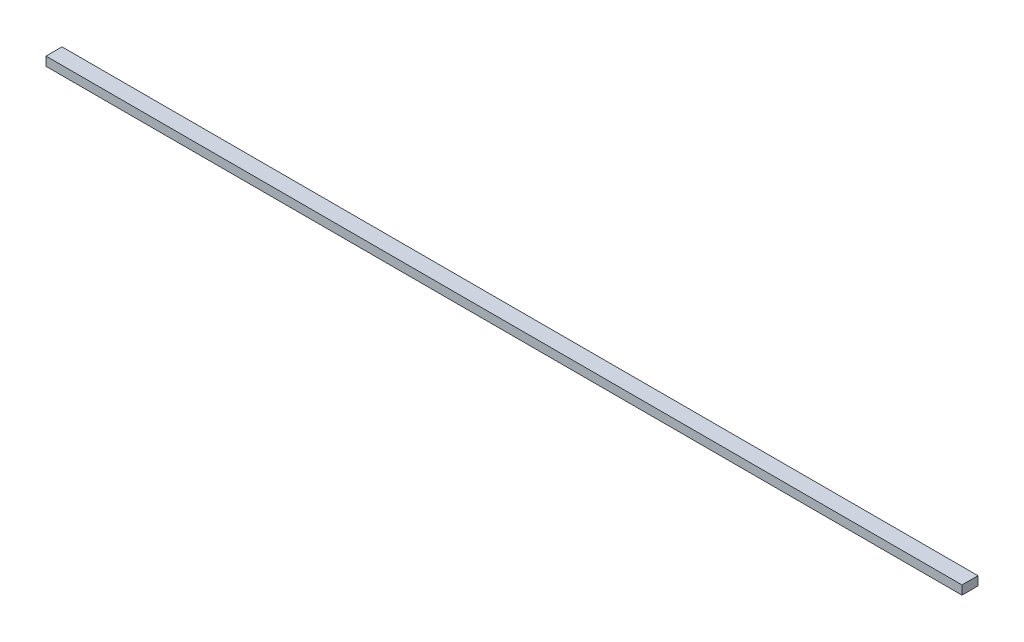
ISO-10303-21;
HEADER;
FILE_DESCRIPTION(('STEP AP214'),'2;1');
FILE_NAME('part.step','',(''),(''),'','','');
FILE_SCHEMA(('AUTOMOTIVE_DESIGN { 1 0 10303 214 1 1 1 1 }'));
ENDSEC;
DATA;
#1=APPLICATION_CONTEXT('core data for automotive mechanical design processes');
#2=APPLICATION_PROTOCOL_DEFINITION('international standard','automotive_design',2000,#1);
#3=PRODUCT_CONTEXT('',#1,'mechanical');
#4=PRODUCT('Part','Part','',(#3));
#5=PRODUCT_RELATED_PRODUCT_CATEGORY('part','',(#4));
#6=PRODUCT_DEFINITION_FORMATION('','',#4);
#7=PRODUCT_DEFINITION_CONTEXT('part definition',#1,'design');
#8=PRODUCT_DEFINITION('design','',#6,#7);
#9=PRODUCT_DEFINITION_SHAPE('','',#8);
#10=(LENGTH_UNIT() NAMED_UNIT(*) SI_UNIT(.MILLI.,.METRE.));
#11=(NAMED_UNIT(*) PLANE_ANGLE_UNIT() SI_UNIT($,.RADIAN.));
#12=(NAMED_UNIT(*) SI_UNIT($,.STERADIAN.) SOLID_ANGLE_UNIT());
#13=UNCERTAINTY_MEASURE_WITH_UNIT(LENGTH_MEASURE(1.E-05),#10,'distance_accuracy_value','');
#14=(GEOMETRIC_REPRESENTATION_CONTEXT(3) GLOBAL_UNCERTAINTY_ASSIGNED_CONTEXT((#13)) GLOBAL_UNIT_ASSIGNED_CONTEXT((#10,
#11,#12)) REPRESENTATION_CONTEXT('',''));
#15=CARTESIAN_POINT('',(0.,0.,0.));
#16=DIRECTION('',(0.,0.,1.));
#17=DIRECTION('',(1.,0.,0.));
#18=AXIS2_PLACEMENT_3D('',#15,#16,#17);
#19=CARTESIAN_POINT('',(257.5,5.,4.5));
#20=DIRECTION('',(-1.,0.,0.));
#21=DIRECTION('',(0.,0.,1.));
#22=AXIS2_PLACEMENT_3D('',#19,#20,#21);
#23=PLANE('',#22);
#24=DIRECTION('',(0.,0.,-1.));
#25=VECTOR('',#24,1.);
#26=CARTESIAN_POINT('',(257.5,0.,4.5));
#27=LINE('',#26,#25);
#28=CARTESIAN_POINT('',(257.5,0.,4.5));
#29=VERTEX_POINT('',#28);
#30=CARTESIAN_POINT('',(257.5,0.,-4.5));
#31=VERTEX_POINT('',#30);
#32=EDGE_CURVE('E107',#29,#31,#27,.T.);
#33=ORIENTED_EDGE('',*,*,#32,.T.);
#34=DIRECTION('',(0.,-1.,0.));
#35=VECTOR('',#34,1.);
#36=CARTESIAN_POINT('',(257.5,5.,-4.5));
#37=LINE('',#36,#35);
#38=CARTESIAN_POINT('',(257.5,5.,-4.5));
#39=VERTEX_POINT('',#38);
#40=EDGE_CURVE('E11',#39,#31,#37,.T.);
#41=ORIENTED_EDGE('',*,*,#40,.F.);
#42=DIRECTION('',(0.,0.,-1.));
#43=VECTOR('',#42,1.);
#44=CARTESIAN_POINT('',(257.5,5.,4.5));
#45=LINE('',#44,#43);
#46=CARTESIAN_POINT('',(257.5,5.,4.5));
#47=VERTEX_POINT('',#46);
#48=EDGE_CURVE('E91',#47,#39,#45,.T.);
#49=ORIENTED_EDGE('',*,*,#48,.F.);
#50=DIRECTION('',(0.,-1.,0.));
#51=VECTOR('',#50,1.);
#52=CARTESIAN_POINT('',(257.5,5.,4.5));
#53=LINE('',#52,#51);
#54=EDGE_CURVE('E103',#47,#29,#53,.T.);
#55=ORIENTED_EDGE('',*,*,#54,.T.);
#56=EDGE_LOOP('',(#33,#41,#49,#55));
#57=FACE_BOUND('',#56,.T.);
#58=ADVANCED_FACE('F39',(#57),#23,.F.);
#59=CARTESIAN_POINT('',(-257.5,5.,-4.5));
#60=DIRECTION('',(0.,0.,1.));
#61=DIRECTION('',(1.,0.,0.));
#62=AXIS2_PLACEMENT_3D('',#59,#60,#61);
#63=PLANE('',#62);
#64=DIRECTION('',(-1.,0.,0.));
#65=VECTOR('',#64,1.);
#66=CARTESIAN_POINT('',(-257.5,0.,-4.5));
#67=LINE('',#66,#65);
#68=CARTESIAN_POINT('',(-257.5,0.,-4.5));
#69=VERTEX_POINT('',#68);
#70=EDGE_CURVE('E96',#31,#69,#67,.T.);
#71=ORIENTED_EDGE('',*,*,#70,.T.);
#72=DIRECTION('',(0.,-1.,0.));
#73=VECTOR('',#72,1.);
#74=CARTESIAN_POINT('',(-257.5,5.,-4.5));
#75=LINE('',#74,#73);
#76=CARTESIAN_POINT('',(-257.5,5.,-4.5));
#77=VERTEX_POINT('',#76);
#78=EDGE_CURVE('E48',#77,#69,#75,.T.);
#79=ORIENTED_EDGE('',*,*,#78,.F.);
#80=DIRECTION('',(-1.,0.,0.));
#81=VECTOR('',#80,1.);
#82=CARTESIAN_POINT('',(-257.5,5.,-4.5));
#83=LINE('',#82,#81);
#84=EDGE_CURVE('E86',#39,#77,#83,.T.);
#85=ORIENTED_EDGE('',*,*,#84,.F.);
#86=ORIENTED_EDGE('',*,*,#40,.T.);
#87=EDGE_LOOP('',(#71,#79,#85,#86));
#88=FACE_BOUND('',#87,.T.);
#89=ADVANCED_FACE('F95',(#88),#63,.F.);
#90=CARTESIAN_POINT('',(-257.5,5.,4.5));
#91=DIRECTION('',(1.,0.,0.));
#92=DIRECTION('',(0.,0.,-1.));
#93=AXIS2_PLACEMENT_3D('',#90,#91,#92);
#94=PLANE('',#93);
#95=DIRECTION('',(0.,0.,1.));
#96=VECTOR('',#95,1.);
#97=CARTESIAN_POINT('',(-257.5,0.,4.5));
#98=LINE('',#97,#96);
#99=CARTESIAN_POINT('',(-257.5,0.,4.5));
#100=VERTEX_POINT('',#99);
#101=EDGE_CURVE('E73',#69,#100,#98,.T.);
#102=ORIENTED_EDGE('',*,*,#101,.T.);
#103=DIRECTION('',(0.,-1.,0.));
#104=VECTOR('',#103,1.);
#105=CARTESIAN_POINT('',(-257.5,5.,4.5));
#106=LINE('',#105,#104);
#107=CARTESIAN_POINT('',(-257.5,5.,4.5));
#108=VERTEX_POINT('',#107);
#109=EDGE_CURVE('E98',#108,#100,#106,.T.);
#110=ORIENTED_EDGE('',*,*,#109,.F.);
#111=DIRECTION('',(0.,0.,1.));
#112=VECTOR('',#111,1.);
#113=CARTESIAN_POINT('',(-257.5,5.,4.5));
#114=LINE('',#113,#112);
#115=EDGE_CURVE('E89',#77,#108,#114,.T.);
#116=ORIENTED_EDGE('',*,*,#115,.F.);
#117=ORIENTED_EDGE('',*,*,#78,.T.);
#118=EDGE_LOOP('',(#102,#110,#116,#117));
#119=FACE_BOUND('',#118,.T.);
#120=ADVANCED_FACE('F99',(#119),#94,.F.);
#121=CARTESIAN_POINT('',(-257.5,5.,4.5));
#122=DIRECTION('',(0.,0.,-1.));
#123=DIRECTION('',(-1.,0.,0.));
#124=AXIS2_PLACEMENT_3D('',#121,#122,#123);
#125=PLANE('',#124);
#126=DIRECTION('',(1.,0.,0.));
#127=VECTOR('',#126,1.);
#128=CARTESIAN_POINT('',(-257.5,0.,4.5));
#129=LINE('',#128,#127);
#130=EDGE_CURVE('E79',#100,#29,#129,.T.);
#131=ORIENTED_EDGE('',*,*,#130,.T.);
#132=ORIENTED_EDGE('',*,*,#54,.F.);
#133=DIRECTION('',(1.,0.,0.));
#134=VECTOR('',#133,1.);
#135=CARTESIAN_POINT('',(-257.5,5.,4.5));
#136=LINE('',#135,#134);
#137=EDGE_CURVE('E56',#108,#47,#136,.T.);
#138=ORIENTED_EDGE('',*,*,#137,.F.);
#139=ORIENTED_EDGE('',*,*,#109,.T.);
#140=EDGE_LOOP('',(#131,#132,#138,#139));
#141=FACE_BOUND('',#140,.T.);
#142=ADVANCED_FACE('F120',(#141),#125,.F.);
#143=CARTESIAN_POINT('',(0.,5.,0.));
#144=DIRECTION('',(0.,-1.,0.));
#145=DIRECTION('',(0.,0.,-1.));
#146=AXIS2_PLACEMENT_3D('',#143,#144,#145);
#147=PLANE('',#146);
#148=ORIENTED_EDGE('',*,*,#48,.T.);
#149=ORIENTED_EDGE('',*,*,#84,.T.);
#150=ORIENTED_EDGE('',*,*,#115,.T.);
#151=ORIENTED_EDGE('',*,*,#137,.T.);
#152=EDGE_LOOP('',(#148,#149,#150,#151));
#153=FACE_BOUND('',#152,.T.);
#154=ADVANCED_FACE('F87',(#153),#147,.F.);
#155=CARTESIAN_POINT('',(0.,0.,0.));
#156=DIRECTION('',(0.,-1.,0.));
#157=DIRECTION('',(0.,0.,-1.));
#158=AXIS2_PLACEMENT_3D('',#155,#156,#157);
#159=PLANE('',#158);
#160=ORIENTED_EDGE('',*,*,#32,.F.);
#161=ORIENTED_EDGE('',*,*,#130,.F.);
#162=ORIENTED_EDGE('',*,*,#101,.F.);
#163=ORIENTED_EDGE('',*,*,#70,.F.);
#164=EDGE_LOOP('',(#160,#161,#162,#163));
#165=FACE_BOUND('',#164,.T.);
#166=ADVANCED_FACE('F123',(#165),#159,.T.);
#167=CLOSED_SHELL('',(#58,#89,#120,#142,#154,#166));
#168=MANIFOLD_SOLID_BREP('B2',#167);
#169=ADVANCED_BREP_SHAPE_REPRESENTATION('',(#18,#168),#14);
#170=SHAPE_DEFINITION_REPRESENTATION(#9,#169);
ENDSEC;
END-ISO-10303-21;
